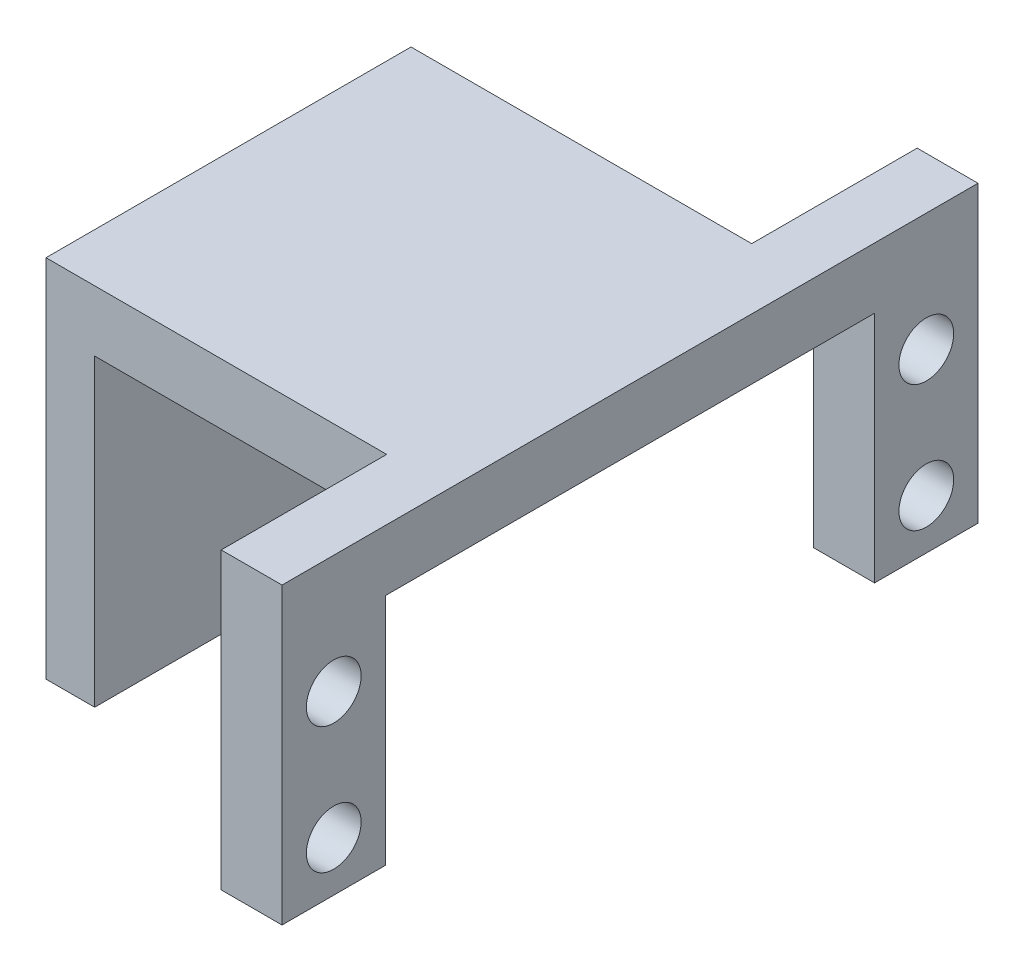
ISO-10303-21;
HEADER;
FILE_DESCRIPTION(('STEP AP214'),'2;1');
FILE_NAME('part.step','',(''),(''),'','','');
FILE_SCHEMA(('AUTOMOTIVE_DESIGN { 1 0 10303 214 1 1 1 1 }'));
ENDSEC;
DATA;
#1=APPLICATION_CONTEXT('core data for automotive mechanical design processes');
#2=APPLICATION_PROTOCOL_DEFINITION('international standard','automotive_design',2000,#1);
#3=PRODUCT_CONTEXT('',#1,'mechanical');
#4=PRODUCT('Part','Part','',(#3));
#5=PRODUCT_RELATED_PRODUCT_CATEGORY('part','',(#4));
#6=PRODUCT_DEFINITION_FORMATION('','',#4);
#7=PRODUCT_DEFINITION_CONTEXT('part definition',#1,'design');
#8=PRODUCT_DEFINITION('design','',#6,#7);
#9=PRODUCT_DEFINITION_SHAPE('','',#8);
#10=(LENGTH_UNIT() NAMED_UNIT(*) SI_UNIT(.MILLI.,.METRE.));
#11=(NAMED_UNIT(*) PLANE_ANGLE_UNIT() SI_UNIT($,.RADIAN.));
#12=(NAMED_UNIT(*) SI_UNIT($,.STERADIAN.) SOLID_ANGLE_UNIT());
#13=UNCERTAINTY_MEASURE_WITH_UNIT(LENGTH_MEASURE(1.E-05),#10,'distance_accuracy_value','');
#14=(GEOMETRIC_REPRESENTATION_CONTEXT(3) GLOBAL_UNCERTAINTY_ASSIGNED_CONTEXT((#13)) GLOBAL_UNIT_ASSIGNED_CONTEXT((#10,
#11,#12)) REPRESENTATION_CONTEXT('',''));
#15=CARTESIAN_POINT('',(0.,0.,0.));
#16=DIRECTION('',(0.,0.,1.));
#17=DIRECTION('',(1.,0.,0.));
#18=AXIS2_PLACEMENT_3D('',#15,#16,#17);
#19=CARTESIAN_POINT('',(4.,0.,0.));
#20=DIRECTION('',(-1.,0.,0.));
#21=DIRECTION('',(0.,0.,1.));
#22=AXIS2_PLACEMENT_3D('',#19,#20,#21);
#23=PLANE('',#22);
#24=DIRECTION('',(0.,0.,-1.));
#25=VECTOR('',#24,1.);
#26=CARTESIAN_POINT('',(4.,25.,0.));
#27=LINE('',#26,#25);
#28=CARTESIAN_POINT('',(4.,25.,0.));
#29=VERTEX_POINT('',#28);
#30=CARTESIAN_POINT('',(4.,25.,-30.));
#31=VERTEX_POINT('',#30);
#32=EDGE_CURVE('E55',#29,#31,#27,.T.);
#33=ORIENTED_EDGE('',*,*,#32,.F.);
#34=DIRECTION('',(0.,-1.,0.));
#35=VECTOR('',#34,1.);
#36=CARTESIAN_POINT('',(4.,0.,0.));
#37=LINE('',#36,#35);
#38=CARTESIAN_POINT('',(4.,0.,0.));
#39=VERTEX_POINT('',#38);
#40=EDGE_CURVE('E94',#29,#39,#37,.T.);
#41=ORIENTED_EDGE('',*,*,#40,.T.);
#42=DIRECTION('',(0.,0.,-1.));
#43=VECTOR('',#42,1.);
#44=CARTESIAN_POINT('',(4.,0.,0.));
#45=LINE('',#44,#43);
#46=CARTESIAN_POINT('',(4.,0.,-30.));
#47=VERTEX_POINT('',#46);
#48=EDGE_CURVE('E61',#39,#47,#45,.T.);
#49=ORIENTED_EDGE('',*,*,#48,.T.);
#50=DIRECTION('',(0.,1.,0.));
#51=VECTOR('',#50,1.);
#52=CARTESIAN_POINT('',(4.,0.,-30.));
#53=LINE('',#52,#51);
#54=EDGE_CURVE('E106',#47,#31,#53,.T.);
#55=ORIENTED_EDGE('',*,*,#54,.T.);
#56=EDGE_LOOP('',(#33,#41,#49,#55));
#57=FACE_BOUND('',#56,.T.);
#58=ADVANCED_FACE('F39',(#57),#23,.F.);
#59=CARTESIAN_POINT('',(4.,0.,0.));
#60=DIRECTION('',(0.,0.,-1.));
#61=DIRECTION('',(-1.,0.,0.));
#62=AXIS2_PLACEMENT_3D('',#59,#60,#61);
#63=PLANE('',#62);
#64=DIRECTION('',(0.,-1.,0.));
#65=VECTOR('',#64,1.);
#66=CARTESIAN_POINT('',(0.,0.,0.));
#67=LINE('',#66,#65);
#68=CARTESIAN_POINT('',(0.,30.,0.));
#69=VERTEX_POINT('',#68);
#70=CARTESIAN_POINT('',(0.,0.,0.));
#71=VERTEX_POINT('',#70);
#72=EDGE_CURVE('E100',#69,#71,#67,.T.);
#73=ORIENTED_EDGE('',*,*,#72,.T.);
#74=DIRECTION('',(-1.,0.,0.));
#75=VECTOR('',#74,1.);
#76=CARTESIAN_POINT('',(4.,0.,0.));
#77=LINE('',#76,#75);
#78=EDGE_CURVE('E11',#39,#71,#77,.T.);
#79=ORIENTED_EDGE('',*,*,#78,.F.);
#80=ORIENTED_EDGE('',*,*,#40,.F.);
#81=DIRECTION('',(-1.,0.,0.));
#82=VECTOR('',#81,1.);
#83=CARTESIAN_POINT('',(28.,25.,0.));
#84=LINE('',#83,#82);
#85=CARTESIAN_POINT('',(28.,25.,0.));
#86=VERTEX_POINT('',#85);
#87=EDGE_CURVE('E111',#86,#29,#84,.T.);
#88=ORIENTED_EDGE('',*,*,#87,.F.);
#89=DIRECTION('',(0.,-1.,0.));
#90=VECTOR('',#89,1.);
#91=CARTESIAN_POINT('',(28.,30.,0.));
#92=LINE('',#91,#90);
#93=CARTESIAN_POINT('',(28.,30.,0.));
#94=VERTEX_POINT('',#93);
#95=EDGE_CURVE('E103',#94,#86,#92,.T.);
#96=ORIENTED_EDGE('',*,*,#95,.F.);
#97=DIRECTION('',(-1.,0.,0.));
#98=VECTOR('',#97,1.);
#99=CARTESIAN_POINT('',(4.,30.,0.));
#100=LINE('',#99,#98);
#101=EDGE_CURVE('E85',#94,#69,#100,.T.);
#102=ORIENTED_EDGE('',*,*,#101,.T.);
#103=EDGE_LOOP('',(#73,#79,#80,#88,#96,#102));
#104=FACE_BOUND('',#103,.T.);
#105=ADVANCED_FACE('F41',(#104),#63,.F.);
#106=CARTESIAN_POINT('',(4.,0.,0.));
#107=DIRECTION('',(0.,1.,0.));
#108=DIRECTION('',(0.,0.,1.));
#109=AXIS2_PLACEMENT_3D('',#106,#107,#108);
#110=PLANE('',#109);
#111=DIRECTION('',(0.,0.,-1.));
#112=VECTOR('',#111,1.);
#113=CARTESIAN_POINT('',(0.,0.,0.));
#114=LINE('',#113,#112);
#115=CARTESIAN_POINT('',(0.,0.,-30.));
#116=VERTEX_POINT('',#115);
#117=EDGE_CURVE('E109',#71,#116,#114,.T.);
#118=ORIENTED_EDGE('',*,*,#117,.T.);
#119=DIRECTION('',(-1.,0.,0.));
#120=VECTOR('',#119,1.);
#121=CARTESIAN_POINT('',(4.,0.,-30.));
#122=LINE('',#121,#120);
#123=EDGE_CURVE('E48',#47,#116,#122,.T.);
#124=ORIENTED_EDGE('',*,*,#123,.F.);
#125=ORIENTED_EDGE('',*,*,#48,.F.);
#126=ORIENTED_EDGE('',*,*,#78,.T.);
#127=EDGE_LOOP('',(#118,#124,#125,#126));
#128=FACE_BOUND('',#127,.T.);
#129=ADVANCED_FACE('F132',(#128),#110,.F.);
#130=CARTESIAN_POINT('',(4.,0.,-30.));
#131=DIRECTION('',(0.,0.,1.));
#132=DIRECTION('',(1.,0.,0.));
#133=AXIS2_PLACEMENT_3D('',#130,#131,#132);
#134=PLANE('',#133);
#135=DIRECTION('',(0.,1.,0.));
#136=VECTOR('',#135,1.);
#137=CARTESIAN_POINT('',(0.,0.,-30.));
#138=LINE('',#137,#136);
#139=CARTESIAN_POINT('',(0.,30.,-30.));
#140=VERTEX_POINT('',#139);
#141=EDGE_CURVE('E95',#116,#140,#138,.T.);
#142=ORIENTED_EDGE('',*,*,#141,.T.);
#143=DIRECTION('',(-1.,0.,0.));
#144=VECTOR('',#143,1.);
#145=CARTESIAN_POINT('',(4.,30.,-30.));
#146=LINE('',#145,#144);
#147=CARTESIAN_POINT('',(28.,30.,-30.));
#148=VERTEX_POINT('',#147);
#149=EDGE_CURVE('E89',#148,#140,#146,.T.);
#150=ORIENTED_EDGE('',*,*,#149,.F.);
#151=DIRECTION('',(0.,1.,0.));
#152=VECTOR('',#151,1.);
#153=CARTESIAN_POINT('',(28.,30.,-30.));
#154=LINE('',#153,#152);
#155=CARTESIAN_POINT('',(28.,25.,-30.));
#156=VERTEX_POINT('',#155);
#157=EDGE_CURVE('E176',#156,#148,#154,.T.);
#158=ORIENTED_EDGE('',*,*,#157,.F.);
#159=DIRECTION('',(-1.,0.,0.));
#160=VECTOR('',#159,1.);
#161=CARTESIAN_POINT('',(28.,25.,-30.));
#162=LINE('',#161,#160);
#163=EDGE_CURVE('E117',#156,#31,#162,.T.);
#164=ORIENTED_EDGE('',*,*,#163,.T.);
#165=ORIENTED_EDGE('',*,*,#54,.F.);
#166=ORIENTED_EDGE('',*,*,#123,.T.);
#167=EDGE_LOOP('',(#142,#150,#158,#164,#165,#166));
#168=FACE_BOUND('',#167,.T.);
#169=ADVANCED_FACE('F129',(#168),#134,.F.);
#170=CARTESIAN_POINT('',(4.,30.,0.));
#171=DIRECTION('',(0.,-1.,0.));
#172=DIRECTION('',(0.,0.,-1.));
#173=AXIS2_PLACEMENT_3D('',#170,#171,#172);
#174=PLANE('',#173);
#175=DIRECTION('',(0.,0.,1.));
#176=VECTOR('',#175,1.);
#177=CARTESIAN_POINT('',(0.,30.,0.));
#178=LINE('',#177,#176);
#179=EDGE_CURVE('E81',#140,#69,#178,.T.);
#180=ORIENTED_EDGE('',*,*,#179,.T.);
#181=ORIENTED_EDGE('',*,*,#101,.F.);
#182=DIRECTION('',(0.,0.,1.));
#183=VECTOR('',#182,1.);
#184=CARTESIAN_POINT('',(28.,30.,5.1));
#185=LINE('',#184,#183);
#186=CARTESIAN_POINT('',(28.,30.,13.6));
#187=VERTEX_POINT('',#186);
#188=EDGE_CURVE('E153',#94,#187,#185,.T.);
#189=ORIENTED_EDGE('',*,*,#188,.T.);
#190=DIRECTION('',(-1.,0.,0.));
#191=VECTOR('',#190,1.);
#192=CARTESIAN_POINT('',(33.,30.,13.6));
#193=LINE('',#192,#191);
#194=CARTESIAN_POINT('',(33.,30.,13.6));
#195=VERTEX_POINT('',#194);
#196=EDGE_CURVE('E285',#195,#187,#193,.T.);
#197=ORIENTED_EDGE('',*,*,#196,.F.);
#198=DIRECTION('',(0.,0.,1.));
#199=VECTOR('',#198,1.);
#200=CARTESIAN_POINT('',(33.,30.,5.1));
#201=LINE('',#200,#199);
#202=CARTESIAN_POINT('',(33.,30.,-43.6));
#203=VERTEX_POINT('',#202);
#204=EDGE_CURVE('E163',#203,#195,#201,.T.);
#205=ORIENTED_EDGE('',*,*,#204,.F.);
#206=DIRECTION('',(-1.,0.,0.));
#207=VECTOR('',#206,1.);
#208=CARTESIAN_POINT('',(33.,30.,-43.6));
#209=LINE('',#208,#207);
#210=CARTESIAN_POINT('',(28.,30.,-43.6));
#211=VERTEX_POINT('',#210);
#212=EDGE_CURVE('E271',#203,#211,#209,.T.);
#213=ORIENTED_EDGE('',*,*,#212,.T.);
#214=EDGE_CURVE('E158',#211,#148,#185,.T.);
#215=ORIENTED_EDGE('',*,*,#214,.T.);
#216=ORIENTED_EDGE('',*,*,#149,.T.);
#217=EDGE_LOOP('',(#180,#181,#189,#197,#205,#213,#215,#216));
#218=FACE_BOUND('',#217,.T.);
#219=ADVANCED_FACE('F83',(#218),#174,.F.);
#220=CARTESIAN_POINT('',(0.,0.,0.));
#221=DIRECTION('',(-1.,0.,0.));
#222=DIRECTION('',(0.,0.,1.));
#223=AXIS2_PLACEMENT_3D('',#220,#221,#222);
#224=PLANE('',#223);
#225=ORIENTED_EDGE('',*,*,#72,.F.);
#226=ORIENTED_EDGE('',*,*,#179,.F.);
#227=ORIENTED_EDGE('',*,*,#141,.F.);
#228=ORIENTED_EDGE('',*,*,#117,.F.);
#229=EDGE_LOOP('',(#225,#226,#227,#228));
#230=FACE_BOUND('',#229,.T.);
#231=ADVANCED_FACE('F108',(#230),#224,.T.);
#232=CARTESIAN_POINT('',(28.,25.,0.));
#233=DIRECTION('',(0.,1.,0.));
#234=DIRECTION('',(0.,0.,1.));
#235=AXIS2_PLACEMENT_3D('',#232,#233,#234);
#236=PLANE('',#235);
#237=ORIENTED_EDGE('',*,*,#32,.T.);
#238=ORIENTED_EDGE('',*,*,#163,.F.);
#239=DIRECTION('',(0.,0.,-1.));
#240=VECTOR('',#239,1.);
#241=CARTESIAN_POINT('',(28.,25.,5.1));
#242=LINE('',#241,#240);
#243=CARTESIAN_POINT('',(28.,25.,-35.1));
#244=VERTEX_POINT('',#243);
#245=EDGE_CURVE('E154',#156,#244,#242,.T.);
#246=ORIENTED_EDGE('',*,*,#245,.T.);
#247=DIRECTION('',(-1.,0.,0.));
#248=VECTOR('',#247,1.);
#249=CARTESIAN_POINT('',(33.,25.,-35.1));
#250=LINE('',#249,#248);
#251=CARTESIAN_POINT('',(33.,25.,-35.1));
#252=VERTEX_POINT('',#251);
#253=EDGE_CURVE('E168',#252,#244,#250,.T.);
#254=ORIENTED_EDGE('',*,*,#253,.F.);
#255=DIRECTION('',(0.,0.,-1.));
#256=VECTOR('',#255,1.);
#257=CARTESIAN_POINT('',(33.,25.,5.1));
#258=LINE('',#257,#256);
#259=CARTESIAN_POINT('',(33.,25.,5.09999999999999));
#260=VERTEX_POINT('',#259);
#261=EDGE_CURVE('E167',#260,#252,#258,.T.);
#262=ORIENTED_EDGE('',*,*,#261,.F.);
#263=DIRECTION('',(-1.,0.,0.));
#264=VECTOR('',#263,1.);
#265=CARTESIAN_POINT('',(33.,25.,5.1));
#266=LINE('',#265,#264);
#267=CARTESIAN_POINT('',(28.,25.,5.1));
#268=VERTEX_POINT('',#267);
#269=EDGE_CURVE('E147',#260,#268,#266,.T.);
#270=ORIENTED_EDGE('',*,*,#269,.T.);
#271=EDGE_CURVE('E143',#268,#86,#242,.T.);
#272=ORIENTED_EDGE('',*,*,#271,.T.);
#273=ORIENTED_EDGE('',*,*,#87,.T.);
#274=EDGE_LOOP('',(#237,#238,#246,#254,#262,#270,#272,#273));
#275=FACE_BOUND('',#274,.T.);
#276=ADVANCED_FACE('F138',(#275),#236,.F.);
#277=CARTESIAN_POINT('',(28.,0.,0.));
#278=DIRECTION('',(1.,0.,0.));
#279=DIRECTION('',(0.,0.,-1.));
#280=AXIS2_PLACEMENT_3D('',#277,#278,#279);
#281=PLANE('',#280);
#282=CARTESIAN_POINT('',(28.,20.3,9.34999999999999));
#283=DIRECTION('',(1.,0.,0.));
#284=DIRECTION('',(0.,0.,-1.));
#285=AXIS2_PLACEMENT_3D('',#282,#283,#284);
#286=CIRCLE('',#285,2.25);
#287=CARTESIAN_POINT('',(28.,20.3,7.1));
#288=VERTEX_POINT('',#287);
#289=EDGE_CURVE('E538',#288,#288,#286,.T.);
#290=ORIENTED_EDGE('',*,*,#289,.T.);
#291=EDGE_LOOP('',(#290));
#292=FACE_BOUND('',#291,.T.);
#293=CARTESIAN_POINT('',(28.,9.9,9.34999999999999));
#294=DIRECTION('',(1.,0.,0.));
#295=DIRECTION('',(0.,0.,-1.));
#296=AXIS2_PLACEMENT_3D('',#293,#294,#295);
#297=CIRCLE('',#296,2.25);
#298=CARTESIAN_POINT('',(28.,9.9,7.1));
#299=VERTEX_POINT('',#298);
#300=EDGE_CURVE('E551',#299,#299,#297,.T.);
#301=ORIENTED_EDGE('',*,*,#300,.T.);
#302=EDGE_LOOP('',(#301));
#303=FACE_BOUND('',#302,.T.);
#304=ORIENTED_EDGE('',*,*,#188,.F.);
#305=ORIENTED_EDGE('',*,*,#95,.T.);
#306=ORIENTED_EDGE('',*,*,#271,.F.);
#307=DIRECTION('',(0.,-1.,0.));
#308=VECTOR('',#307,1.);
#309=CARTESIAN_POINT('',(28.,30.,5.09999999999999));
#310=LINE('',#309,#308);
#311=CARTESIAN_POINT('',(28.,5.8,5.09999999999999));
#312=VERTEX_POINT('',#311);
#313=EDGE_CURVE('E300',#268,#312,#310,.T.);
#314=ORIENTED_EDGE('',*,*,#313,.T.);
#315=DIRECTION('',(0.,0.,-1.));
#316=VECTOR('',#315,1.);
#317=CARTESIAN_POINT('',(28.,5.8,13.6));
#318=LINE('',#317,#316);
#319=CARTESIAN_POINT('',(28.,5.8,13.6));
#320=VERTEX_POINT('',#319);
#321=EDGE_CURVE('E161',#320,#312,#318,.T.);
#322=ORIENTED_EDGE('',*,*,#321,.F.);
#323=DIRECTION('',(0.,-1.,0.));
#324=VECTOR('',#323,1.);
#325=CARTESIAN_POINT('',(28.,30.,13.6));
#326=LINE('',#325,#324);
#327=EDGE_CURVE('E290',#187,#320,#326,.T.);
#328=ORIENTED_EDGE('',*,*,#327,.F.);
#329=EDGE_LOOP('',(#304,#305,#306,#314,#322,#328));
#330=FACE_BOUND('',#329,.T.);
#331=ADVANCED_FACE('F330',(#292,#303,#330),#281,.F.);
#332=CARTESIAN_POINT('',(28.,20.3,-39.35));
#333=DIRECTION('',(1.,0.,0.));
#334=DIRECTION('',(0.,0.,-1.));
#335=AXIS2_PLACEMENT_3D('',#332,#333,#334);
#336=CIRCLE('',#335,2.25);
#337=CARTESIAN_POINT('',(28.,20.3,-41.6));
#338=VERTEX_POINT('',#337);
#339=EDGE_CURVE('E559',#338,#338,#336,.T.);
#340=ORIENTED_EDGE('',*,*,#339,.T.);
#341=EDGE_LOOP('',(#340));
#342=FACE_BOUND('',#341,.T.);
#343=CARTESIAN_POINT('',(28.,9.9,-39.35));
#344=DIRECTION('',(1.,0.,0.));
#345=DIRECTION('',(0.,0.,-1.));
#346=AXIS2_PLACEMENT_3D('',#343,#344,#345);
#347=CIRCLE('',#346,2.25);
#348=CARTESIAN_POINT('',(28.,9.9,-41.6));
#349=VERTEX_POINT('',#348);
#350=EDGE_CURVE('E272',#349,#349,#347,.T.);
#351=ORIENTED_EDGE('',*,*,#350,.T.);
#352=EDGE_LOOP('',(#351));
#353=FACE_BOUND('',#352,.T.);
#354=ORIENTED_EDGE('',*,*,#245,.F.);
#355=ORIENTED_EDGE('',*,*,#157,.T.);
#356=ORIENTED_EDGE('',*,*,#214,.F.);
#357=DIRECTION('',(0.,-1.,0.));
#358=VECTOR('',#357,1.);
#359=CARTESIAN_POINT('',(28.,30.,-43.6));
#360=LINE('',#359,#358);
#361=CARTESIAN_POINT('',(28.,5.8,-43.6));
#362=VERTEX_POINT('',#361);
#363=EDGE_CURVE('E251',#211,#362,#360,.T.);
#364=ORIENTED_EDGE('',*,*,#363,.T.);
#365=DIRECTION('',(0.,0.,-1.));
#366=VECTOR('',#365,1.);
#367=CARTESIAN_POINT('',(28.,5.8,-35.1));
#368=LINE('',#367,#366);
#369=CARTESIAN_POINT('',(28.,5.8,-35.1));
#370=VERTEX_POINT('',#369);
#371=EDGE_CURVE('E248',#370,#362,#368,.T.);
#372=ORIENTED_EDGE('',*,*,#371,.F.);
#373=DIRECTION('',(0.,-1.,0.));
#374=VECTOR('',#373,1.);
#375=CARTESIAN_POINT('',(28.,30.,-35.1));
#376=LINE('',#375,#374);
#377=EDGE_CURVE('E234',#244,#370,#376,.T.);
#378=ORIENTED_EDGE('',*,*,#377,.F.);
#379=EDGE_LOOP('',(#354,#355,#356,#364,#372,#378));
#380=FACE_BOUND('',#379,.T.);
#381=ADVANCED_FACE('F249',(#342,#353,#380),#281,.F.);
#382=CARTESIAN_POINT('',(33.,0.,0.));
#383=DIRECTION('',(1.,0.,0.));
#384=DIRECTION('',(0.,0.,-1.));
#385=AXIS2_PLACEMENT_3D('',#382,#383,#384);
#386=PLANE('',#385);
#387=CARTESIAN_POINT('',(33.,20.3,9.34999999999999));
#388=DIRECTION('',(1.,0.,0.));
#389=DIRECTION('',(0.,0.,-1.));
#390=AXIS2_PLACEMENT_3D('',#387,#388,#389);
#391=CIRCLE('',#390,2.25);
#392=CARTESIAN_POINT('',(33.,20.3,7.1));
#393=VERTEX_POINT('',#392);
#394=EDGE_CURVE('E541',#393,#393,#391,.T.);
#395=ORIENTED_EDGE('',*,*,#394,.F.);
#396=EDGE_LOOP('',(#395));
#397=FACE_BOUND('',#396,.T.);
#398=CARTESIAN_POINT('',(33.,9.9,9.34999999999999));
#399=DIRECTION('',(1.,0.,0.));
#400=DIRECTION('',(0.,0.,-1.));
#401=AXIS2_PLACEMENT_3D('',#398,#399,#400);
#402=CIRCLE('',#401,2.25);
#403=CARTESIAN_POINT('',(33.,9.9,7.1));
#404=VERTEX_POINT('',#403);
#405=EDGE_CURVE('E545',#404,#404,#402,.T.);
#406=ORIENTED_EDGE('',*,*,#405,.F.);
#407=EDGE_LOOP('',(#406));
#408=FACE_BOUND('',#407,.T.);
#409=CARTESIAN_POINT('',(33.,20.3,-39.35));
#410=DIRECTION('',(1.,0.,0.));
#411=DIRECTION('',(0.,0.,-1.));
#412=AXIS2_PLACEMENT_3D('',#409,#410,#411);
#413=CIRCLE('',#412,2.25);
#414=CARTESIAN_POINT('',(33.,20.3,-41.6));
#415=VERTEX_POINT('',#414);
#416=EDGE_CURVE('E555',#415,#415,#413,.T.);
#417=ORIENTED_EDGE('',*,*,#416,.F.);
#418=EDGE_LOOP('',(#417));
#419=FACE_BOUND('',#418,.T.);
#420=CARTESIAN_POINT('',(33.,9.9,-39.35));
#421=DIRECTION('',(1.,0.,0.));
#422=DIRECTION('',(0.,0.,-1.));
#423=AXIS2_PLACEMENT_3D('',#420,#421,#422);
#424=CIRCLE('',#423,2.25);
#425=CARTESIAN_POINT('',(33.,9.9,-41.6));
#426=VERTEX_POINT('',#425);
#427=EDGE_CURVE('E563',#426,#426,#424,.T.);
#428=ORIENTED_EDGE('',*,*,#427,.F.);
#429=EDGE_LOOP('',(#428));
#430=FACE_BOUND('',#429,.T.);
#431=ORIENTED_EDGE('',*,*,#204,.T.);
#432=DIRECTION('',(0.,1.,0.));
#433=VECTOR('',#432,1.);
#434=CARTESIAN_POINT('',(33.,30.,13.6));
#435=LINE('',#434,#433);
#436=CARTESIAN_POINT('',(33.,5.8,13.6));
#437=VERTEX_POINT('',#436);
#438=EDGE_CURVE('E281',#437,#195,#435,.T.);
#439=ORIENTED_EDGE('',*,*,#438,.F.);
#440=DIRECTION('',(0.,0.,-1.));
#441=VECTOR('',#440,1.);
#442=CARTESIAN_POINT('',(33.,5.8,13.6));
#443=LINE('',#442,#441);
#444=CARTESIAN_POINT('',(33.,5.8,5.09999999999999));
#445=VERTEX_POINT('',#444);
#446=EDGE_CURVE('E296',#437,#445,#443,.T.);
#447=ORIENTED_EDGE('',*,*,#446,.T.);
#448=DIRECTION('',(0.,1.,0.));
#449=VECTOR('',#448,1.);
#450=CARTESIAN_POINT('',(33.,30.,5.09999999999999));
#451=LINE('',#450,#449);
#452=EDGE_CURVE('E255',#445,#260,#451,.T.);
#453=ORIENTED_EDGE('',*,*,#452,.T.);
#454=ORIENTED_EDGE('',*,*,#261,.T.);
#455=DIRECTION('',(0.,1.,0.));
#456=VECTOR('',#455,1.);
#457=CARTESIAN_POINT('',(33.,30.,-35.1));
#458=LINE('',#457,#456);
#459=CARTESIAN_POINT('',(33.,5.8,-35.1));
#460=VERTEX_POINT('',#459);
#461=EDGE_CURVE('E245',#460,#252,#458,.T.);
#462=ORIENTED_EDGE('',*,*,#461,.F.);
#463=DIRECTION('',(0.,0.,-1.));
#464=VECTOR('',#463,1.);
#465=CARTESIAN_POINT('',(33.,5.8,-35.1));
#466=LINE('',#465,#464);
#467=CARTESIAN_POINT('',(33.,5.8,-43.6));
#468=VERTEX_POINT('',#467);
#469=EDGE_CURVE('E256',#460,#468,#466,.T.);
#470=ORIENTED_EDGE('',*,*,#469,.T.);
#471=DIRECTION('',(0.,1.,0.));
#472=VECTOR('',#471,1.);
#473=CARTESIAN_POINT('',(33.,30.,-43.6));
#474=LINE('',#473,#472);
#475=EDGE_CURVE('E267',#468,#203,#474,.T.);
#476=ORIENTED_EDGE('',*,*,#475,.T.);
#477=EDGE_LOOP('',(#431,#439,#447,#453,#454,#462,#470,#476));
#478=FACE_BOUND('',#477,.T.);
#479=ADVANCED_FACE('F315',(#397,#408,#419,#430,#478),#386,.T.);
#480=CARTESIAN_POINT('',(0.,0.,5.09999999999999));
#481=DIRECTION('',(0.,0.,-1.));
#482=DIRECTION('',(-1.,0.,0.));
#483=AXIS2_PLACEMENT_3D('',#480,#481,#482);
#484=PLANE('',#483);
#485=ORIENTED_EDGE('',*,*,#269,.F.);
#486=ORIENTED_EDGE('',*,*,#452,.F.);
#487=DIRECTION('',(1.,0.,0.));
#488=VECTOR('',#487,1.);
#489=CARTESIAN_POINT('',(33.,5.8,5.09999999999999));
#490=LINE('',#489,#488);
#491=EDGE_CURVE('E286',#312,#445,#490,.T.);
#492=ORIENTED_EDGE('',*,*,#491,.F.);
#493=ORIENTED_EDGE('',*,*,#313,.F.);
#494=EDGE_LOOP('',(#485,#486,#492,#493));
#495=FACE_BOUND('',#494,.T.);
#496=ADVANCED_FACE('F329',(#495),#484,.T.);
#497=CARTESIAN_POINT('',(33.,5.8,13.6));
#498=DIRECTION('',(0.,1.,0.));
#499=DIRECTION('',(-1.,0.,0.));
#500=AXIS2_PLACEMENT_3D('',#497,#498,#499);
#501=PLANE('',#500);
#502=ORIENTED_EDGE('',*,*,#491,.T.);
#503=ORIENTED_EDGE('',*,*,#446,.F.);
#504=DIRECTION('',(1.,0.,0.));
#505=VECTOR('',#504,1.);
#506=CARTESIAN_POINT('',(33.,5.8,13.6));
#507=LINE('',#506,#505);
#508=EDGE_CURVE('E293',#320,#437,#507,.T.);
#509=ORIENTED_EDGE('',*,*,#508,.F.);
#510=ORIENTED_EDGE('',*,*,#321,.T.);
#511=EDGE_LOOP('',(#502,#503,#509,#510));
#512=FACE_BOUND('',#511,.T.);
#513=ADVANCED_FACE('F325',(#512),#501,.F.);
#514=CARTESIAN_POINT('',(0.,0.,13.6));
#515=DIRECTION('',(0.,0.,-1.));
#516=DIRECTION('',(-1.,0.,0.));
#517=AXIS2_PLACEMENT_3D('',#514,#515,#516);
#518=PLANE('',#517);
#519=ORIENTED_EDGE('',*,*,#438,.T.);
#520=ORIENTED_EDGE('',*,*,#196,.T.);
#521=ORIENTED_EDGE('',*,*,#327,.T.);
#522=ORIENTED_EDGE('',*,*,#508,.T.);
#523=EDGE_LOOP('',(#519,#520,#521,#522));
#524=FACE_BOUND('',#523,.T.);
#525=ADVANCED_FACE('F320',(#524),#518,.F.);
#526=CARTESIAN_POINT('',(0.,0.,-35.1));
#527=DIRECTION('',(0.,0.,-1.));
#528=DIRECTION('',(-1.,0.,0.));
#529=AXIS2_PLACEMENT_3D('',#526,#527,#528);
#530=PLANE('',#529);
#531=ORIENTED_EDGE('',*,*,#461,.T.);
#532=ORIENTED_EDGE('',*,*,#253,.T.);
#533=ORIENTED_EDGE('',*,*,#377,.T.);
#534=DIRECTION('',(1.,0.,0.));
#535=VECTOR('',#534,1.);
#536=CARTESIAN_POINT('',(33.,5.8,-35.1));
#537=LINE('',#536,#535);
#538=EDGE_CURVE('E239',#370,#460,#537,.T.);
#539=ORIENTED_EDGE('',*,*,#538,.T.);
#540=EDGE_LOOP('',(#531,#532,#533,#539));
#541=FACE_BOUND('',#540,.T.);
#542=ADVANCED_FACE('F237',(#541),#530,.F.);
#543=CARTESIAN_POINT('',(33.,5.8,-35.1));
#544=DIRECTION('',(0.,1.,0.));
#545=DIRECTION('',(-1.,0.,0.));
#546=AXIS2_PLACEMENT_3D('',#543,#544,#545);
#547=PLANE('',#546);
#548=DIRECTION('',(1.,0.,0.));
#549=VECTOR('',#548,1.);
#550=CARTESIAN_POINT('',(33.,5.8,-43.6));
#551=LINE('',#550,#549);
#552=EDGE_CURVE('E278',#362,#468,#551,.T.);
#553=ORIENTED_EDGE('',*,*,#552,.T.);
#554=ORIENTED_EDGE('',*,*,#469,.F.);
#555=ORIENTED_EDGE('',*,*,#538,.F.);
#556=ORIENTED_EDGE('',*,*,#371,.T.);
#557=EDGE_LOOP('',(#553,#554,#555,#556));
#558=FACE_BOUND('',#557,.T.);
#559=ADVANCED_FACE('F258',(#558),#547,.F.);
#560=CARTESIAN_POINT('',(0.,0.,-43.6));
#561=DIRECTION('',(0.,0.,-1.));
#562=DIRECTION('',(-1.,0.,0.));
#563=AXIS2_PLACEMENT_3D('',#560,#561,#562);
#564=PLANE('',#563);
#565=ORIENTED_EDGE('',*,*,#475,.F.);
#566=ORIENTED_EDGE('',*,*,#552,.F.);
#567=ORIENTED_EDGE('',*,*,#363,.F.);
#568=ORIENTED_EDGE('',*,*,#212,.F.);
#569=EDGE_LOOP('',(#565,#566,#567,#568));
#570=FACE_BOUND('',#569,.T.);
#571=ADVANCED_FACE('F405',(#570),#564,.T.);
#572=CARTESIAN_POINT('',(33.,9.9,-39.35));
#573=DIRECTION('',(1.,0.,0.));
#574=DIRECTION('',(0.,0.,-1.));
#575=AXIS2_PLACEMENT_3D('',#572,#573,#574);
#576=CYLINDRICAL_SURFACE('',#575,2.25);
#577=ORIENTED_EDGE('',*,*,#350,.F.);
#578=EDGE_LOOP('',(#577));
#579=FACE_BOUND('',#578,.T.);
#580=ORIENTED_EDGE('',*,*,#427,.T.);
#581=EDGE_LOOP('',(#580));
#582=FACE_BOUND('',#581,.T.);
#583=ADVANCED_FACE('F413',(#579,#582),#576,.F.);
#584=CARTESIAN_POINT('',(33.,20.3,-39.35));
#585=DIRECTION('',(1.,0.,0.));
#586=DIRECTION('',(0.,0.,-1.));
#587=AXIS2_PLACEMENT_3D('',#584,#585,#586);
#588=CYLINDRICAL_SURFACE('',#587,2.25);
#589=ORIENTED_EDGE('',*,*,#339,.F.);
#590=EDGE_LOOP('',(#589));
#591=FACE_BOUND('',#590,.T.);
#592=ORIENTED_EDGE('',*,*,#416,.T.);
#593=EDGE_LOOP('',(#592));
#594=FACE_BOUND('',#593,.T.);
#595=ADVANCED_FACE('F445',(#591,#594),#588,.F.);
#596=CARTESIAN_POINT('',(33.,9.9,9.34999999999999));
#597=DIRECTION('',(1.,0.,0.));
#598=DIRECTION('',(0.,0.,-1.));
#599=AXIS2_PLACEMENT_3D('',#596,#597,#598);
#600=CYLINDRICAL_SURFACE('',#599,2.25);
#601=ORIENTED_EDGE('',*,*,#300,.F.);
#602=EDGE_LOOP('',(#601));
#603=FACE_BOUND('',#602,.T.);
#604=ORIENTED_EDGE('',*,*,#405,.T.);
#605=EDGE_LOOP('',(#604));
#606=FACE_BOUND('',#605,.T.);
#607=ADVANCED_FACE('F455',(#603,#606),#600,.F.);
#608=CARTESIAN_POINT('',(33.,20.3,9.34999999999999));
#609=DIRECTION('',(1.,0.,0.));
#610=DIRECTION('',(0.,0.,-1.));
#611=AXIS2_PLACEMENT_3D('',#608,#609,#610);
#612=CYLINDRICAL_SURFACE('',#611,2.25);
#613=ORIENTED_EDGE('',*,*,#289,.F.);
#614=EDGE_LOOP('',(#613));
#615=FACE_BOUND('',#614,.T.);
#616=ORIENTED_EDGE('',*,*,#394,.T.);
#617=EDGE_LOOP('',(#616));
#618=FACE_BOUND('',#617,.T.);
#619=ADVANCED_FACE('F465',(#615,#618),#612,.F.);
#620=CLOSED_SHELL('',(#58,#105,#129,#169,#219,#231,#276,#331,#381,#479,#496,#513,#525,#542,#559,
#571,#583,#595,#607,#619));
#621=MANIFOLD_SOLID_BREP('B2',#620);
#622=ADVANCED_BREP_SHAPE_REPRESENTATION('',(#18,#621),#14);
#623=SHAPE_DEFINITION_REPRESENTATION(#9,#622);
ENDSEC;
END-ISO-10303-21;
